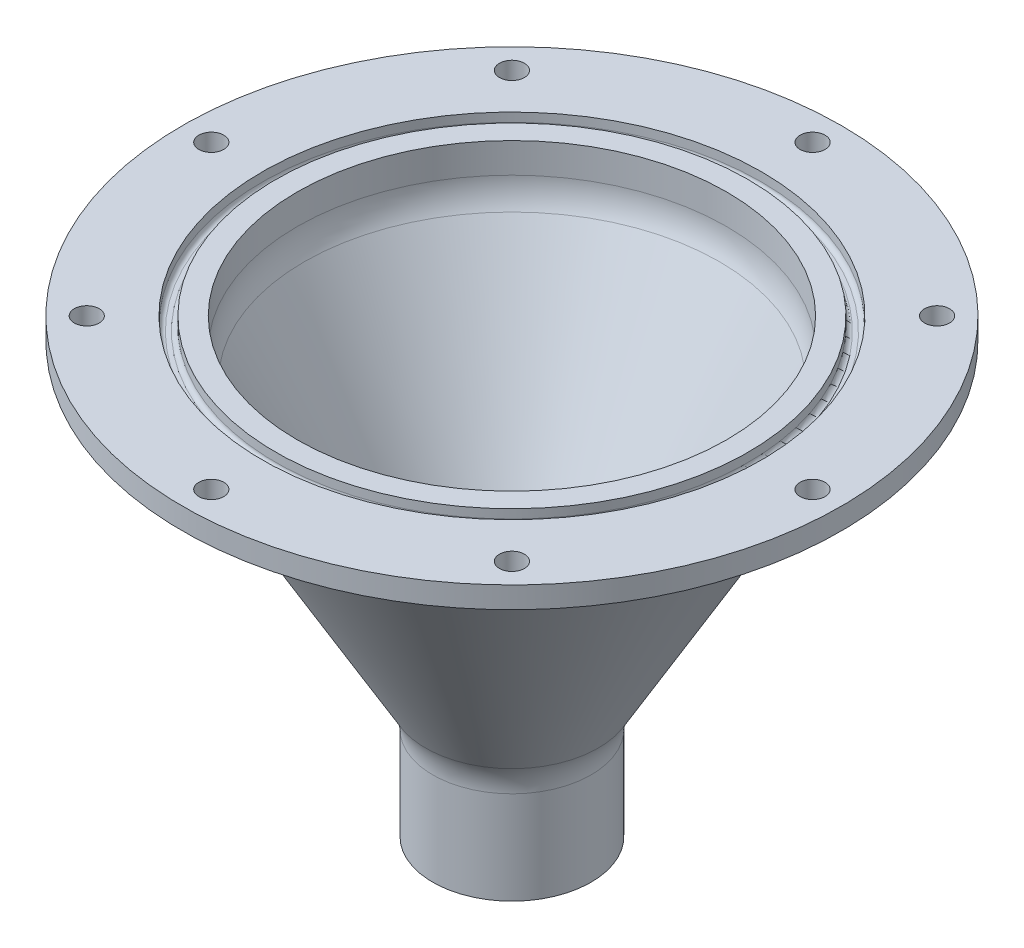
ISO-10303-21;
HEADER;
FILE_DESCRIPTION(('STEP AP214'),'2;1');
FILE_NAME('part.step','',(''),(''),'','','');
FILE_SCHEMA(('AUTOMOTIVE_DESIGN { 1 0 10303 214 1 1 1 1 }'));
ENDSEC;
DATA;
#1=APPLICATION_CONTEXT('core data for automotive mechanical design processes');
#2=APPLICATION_PROTOCOL_DEFINITION('international standard','automotive_design',2000,#1);
#3=PRODUCT_CONTEXT('',#1,'mechanical');
#4=PRODUCT('Part','Part','',(#3));
#5=PRODUCT_RELATED_PRODUCT_CATEGORY('part','',(#4));
#6=PRODUCT_DEFINITION_FORMATION('','',#4);
#7=PRODUCT_DEFINITION_CONTEXT('part definition',#1,'design');
#8=PRODUCT_DEFINITION('design','',#6,#7);
#9=PRODUCT_DEFINITION_SHAPE('','',#8);
#10=(LENGTH_UNIT() NAMED_UNIT(*) SI_UNIT(.MILLI.,.METRE.));
#11=(NAMED_UNIT(*) PLANE_ANGLE_UNIT() SI_UNIT($,.RADIAN.));
#12=(NAMED_UNIT(*) SI_UNIT($,.STERADIAN.) SOLID_ANGLE_UNIT());
#13=UNCERTAINTY_MEASURE_WITH_UNIT(LENGTH_MEASURE(1.E-05),#10,'distance_accuracy_value','');
#14=(GEOMETRIC_REPRESENTATION_CONTEXT(3) GLOBAL_UNCERTAINTY_ASSIGNED_CONTEXT((#13)) GLOBAL_UNIT_ASSIGNED_CONTEXT((#10,
#11,#12)) REPRESENTATION_CONTEXT('',''));
#15=CARTESIAN_POINT('',(0.,0.,0.));
#16=DIRECTION('',(0.,0.,1.));
#17=DIRECTION('',(1.,0.,0.));
#18=AXIS2_PLACEMENT_3D('',#15,#16,#17);
#19=CARTESIAN_POINT('',(9.36625,0.,0.));
#20=DIRECTION('',(0.,-1.,0.));
#21=DIRECTION('',(0.,0.,-1.));
#22=AXIS2_PLACEMENT_3D('',#19,#20,#21);
#23=PLANE('',#22);
#24=CARTESIAN_POINT('',(0.,0.,0.));
#25=DIRECTION('',(0.,-1.,0.));
#26=DIRECTION('',(0.,0.,-1.));
#27=AXIS2_PLACEMENT_3D('',#24,#25,#26);
#28=CIRCLE('',#27,9.36625);
#29=CARTESIAN_POINT('',(0.,0.,-9.36625));
#30=VERTEX_POINT('',#29);
#31=EDGE_CURVE('E105',#30,#30,#28,.T.);
#32=ORIENTED_EDGE('',*,*,#31,.T.);
#33=EDGE_LOOP('',(#32));
#34=FACE_BOUND('',#33,.T.);
#35=CARTESIAN_POINT('',(0.,0.,0.));
#36=DIRECTION('',(0.,-1.,0.));
#37=DIRECTION('',(0.,0.,-1.));
#38=AXIS2_PLACEMENT_3D('',#35,#36,#37);
#39=CIRCLE('',#38,5.55625);
#40=CARTESIAN_POINT('',(0.,0.,-5.55625));
#41=VERTEX_POINT('',#40);
#42=EDGE_CURVE('E10',#41,#41,#39,.T.);
#43=ORIENTED_EDGE('',*,*,#42,.F.);
#44=EDGE_LOOP('',(#43));
#45=FACE_BOUND('',#44,.T.);
#46=ADVANCED_FACE('F35',(#34,#45),#23,.T.);
#47=CARTESIAN_POINT('',(0.,0.,0.));
#48=DIRECTION('',(0.,-1.,0.));
#49=DIRECTION('',(0.,0.,-1.));
#50=AXIS2_PLACEMENT_3D('',#47,#48,#49);
#51=CYLINDRICAL_SURFACE('',#50,5.55625);
#52=ORIENTED_EDGE('',*,*,#42,.T.);
#53=EDGE_LOOP('',(#52));
#54=FACE_BOUND('',#53,.T.);
#55=CARTESIAN_POINT('',(0.,12.0194090512249,0.));
#56=DIRECTION('',(0.,-1.,0.));
#57=DIRECTION('',(0.,0.,-1.));
#58=AXIS2_PLACEMENT_3D('',#55,#56,#57);
#59=CIRCLE('',#58,5.55625);
#60=CARTESIAN_POINT('',(0.,12.0194090512249,-5.55625));
#61=VERTEX_POINT('',#60);
#62=EDGE_CURVE('E42',#61,#61,#59,.T.);
#63=ORIENTED_EDGE('',*,*,#62,.F.);
#64=EDGE_LOOP('',(#63));
#65=FACE_BOUND('',#64,.T.);
#66=ADVANCED_FACE('F206',(#54,#65),#51,.F.);
#67=CARTESIAN_POINT('',(0.,12.0194090512249,0.));
#68=DIRECTION('',(0.,-1.,0.));
#69=DIRECTION('',(0.,0.,-1.));
#70=AXIS2_PLACEMENT_3D('',#67,#68,#69);
#71=TOROIDAL_SURFACE('',#70,11.90625,6.35);
#72=ORIENTED_EDGE('',*,*,#62,.T.);
#73=EDGE_LOOP('',(#72));
#74=FACE_BOUND('',#73,.T.);
#75=CARTESIAN_POINT('',(0.,15.1944090512249,0.));
#76=DIRECTION('',(0.,-1.,0.));
#77=DIRECTION('',(0.,0.,-1.));
#78=AXIS2_PLACEMENT_3D('',#75,#76,#77);
#79=CIRCLE('',#78,6.40698868596882);
#80=CARTESIAN_POINT('',(0.,15.1944090512249,6.40698868596882));
#81=VERTEX_POINT('',#80);
#82=EDGE_CURVE('E46',#81,#81,#79,.T.);
#83=ORIENTED_EDGE('',*,*,#82,.F.);
#84=EDGE_LOOP('',(#83));
#85=FACE_BOUND('',#84,.T.);
#86=ADVANCED_FACE('F210',(#74,#85),#71,.T.);
#87=CARTESIAN_POINT('',(0.,46.617747007795,0.));
#88=DIRECTION('',(0.,1.,0.));
#89=DIRECTION('',(0.,0.,1.));
#90=AXIS2_PLACEMENT_3D('',#87,#88,#89);
#91=CONICAL_SURFACE('',#90,24.5492613140312,0.5235987755983);
#92=CARTESIAN_POINT('',(0.,46.617747007795,0.));
#93=DIRECTION('',(0.,-1.,0.));
#94=DIRECTION('',(0.,0.,-1.));
#95=AXIS2_PLACEMENT_3D('',#92,#93,#94);
#96=CIRCLE('',#95,24.5492613140312);
#97=CARTESIAN_POINT('',(0.,46.617747007795,24.5492613140312));
#98=VERTEX_POINT('',#97);
#99=EDGE_CURVE('E51',#98,#98,#96,.T.);
#100=CARTESIAN_POINT('',(0.,15.1944090512249,6.40698868596882));
#101=CARTESIAN_POINT('',(0.,15.5217354882725,6.59597069251114));
#102=CARTESIAN_POINT('',(0.,15.8490619253201,6.78495269905345));
#103=CARTESIAN_POINT('',(0.,16.5037147994154,7.16291671213809));
#104=CARTESIAN_POINT('',(0.,16.831041236463,7.3518987186804));
#105=CARTESIAN_POINT('',(0.,17.4856941105582,7.72986273176503));
#106=CARTESIAN_POINT('',(0.,17.8130205476058,7.91884473830735));
#107=CARTESIAN_POINT('',(0.,18.467673421701,8.29680875139198));
#108=CARTESIAN_POINT('',(0.,18.7949998587486,8.4857907579343));
#109=CARTESIAN_POINT('',(0.,19.4496527328438,8.86375477101893));
#110=CARTESIAN_POINT('',(0.,19.7769791698914,9.05273677756125));
#111=CARTESIAN_POINT('',(0.,20.4316320439866,9.43070079064588));
#112=CARTESIAN_POINT('',(0.,20.7589584810342,9.6196827971882));
#113=CARTESIAN_POINT('',(0.,21.4136113551294,9.99764681027283));
#114=CARTESIAN_POINT('',(0.,21.740937792177,10.1866288168151));
#115=CARTESIAN_POINT('',(0.,22.3955906662722,10.5645928298998));
#116=CARTESIAN_POINT('',(0.,22.7229171033199,10.7535748364421));
#117=CARTESIAN_POINT('',(0.,23.3775699774151,11.1315388495267));
#118=CARTESIAN_POINT('',(0.,23.7048964144627,11.320520856069));
#119=CARTESIAN_POINT('',(0.,24.3595492885579,11.6984848691537));
#120=CARTESIAN_POINT('',(0.,24.6868757256055,11.887466875696));
#121=CARTESIAN_POINT('',(0.,25.3415285997007,12.2654308887806));
#122=CARTESIAN_POINT('',(0.,25.6688550367483,12.4544128953229));
#123=CARTESIAN_POINT('',(0.,26.3235079108435,12.8323769084076));
#124=CARTESIAN_POINT('',(0.,26.6508343478911,13.0213589149499));
#125=CARTESIAN_POINT('',(0.,27.3054872219863,13.3993229280345));
#126=CARTESIAN_POINT('',(0.,27.6328136590339,13.5883049345768));
#127=CARTESIAN_POINT('',(0.,28.2874665331291,13.9662689476615));
#128=CARTESIAN_POINT('',(0.,28.6147929701767,14.1552509542038));
#129=CARTESIAN_POINT('',(0.,29.269445844272,14.5332149672884));
#130=CARTESIAN_POINT('',(0.,29.5967722813196,14.7221969738307));
#131=CARTESIAN_POINT('',(0.,30.2514251554148,15.1001609869154));
#132=CARTESIAN_POINT('',(0.,30.5787515924624,15.2891429934577));
#133=CARTESIAN_POINT('',(0.,31.2334044665576,15.6671070065423));
#134=CARTESIAN_POINT('',(0.,31.5607309036052,15.8560890130846));
#135=CARTESIAN_POINT('',(0.,32.2153837777004,16.2340530261693));
#136=CARTESIAN_POINT('',(0.,32.542710214748,16.4230350327116));
#137=CARTESIAN_POINT('',(0.,33.1973630888432,16.8009990457962));
#138=CARTESIAN_POINT('',(0.,33.5246895258908,16.9899810523385));
#139=CARTESIAN_POINT('',(0.,34.179342399986,17.3679450654232));
#140=CARTESIAN_POINT('',(0.,34.5066688370336,17.5569270719655));
#141=CARTESIAN_POINT('',(0.,35.1613217111288,17.9348910850501));
#142=CARTESIAN_POINT('',(0.,35.4886481481764,18.1238730915924));
#143=CARTESIAN_POINT('',(0.,36.1433010222717,18.5018371046771));
#144=CARTESIAN_POINT('',(0.,36.4706274593193,18.6908191112194));
#145=CARTESIAN_POINT('',(0.,37.1252803334145,19.068783124304));
#146=CARTESIAN_POINT('',(0.,37.4526067704621,19.2577651308463));
#147=CARTESIAN_POINT('',(0.,38.1072596445573,19.635729143931));
#148=CARTESIAN_POINT('',(0.,38.4345860816049,19.8247111504733));
#149=CARTESIAN_POINT('',(0.,39.0892389557001,20.2026751635579));
#150=CARTESIAN_POINT('',(0.,39.4165653927477,20.3916571701002));
#151=CARTESIAN_POINT('',(0.,40.0712182668429,20.7696211831849));
#152=CARTESIAN_POINT('',(0.,40.3985447038905,20.9586031897272));
#153=CARTESIAN_POINT('',(0.,41.0531975779857,21.3365672028118));
#154=CARTESIAN_POINT('',(0.,41.3805240150333,21.5255492093541));
#155=CARTESIAN_POINT('',(0.,42.0351768891285,21.9035132224388));
#156=CARTESIAN_POINT('',(0.,42.3625033261761,22.0924952289811));
#157=CARTESIAN_POINT('',(0.,43.0171562002714,22.4704592420657));
#158=CARTESIAN_POINT('',(0.,43.344482637319,22.659441248608));
#159=CARTESIAN_POINT('',(0.,43.9991355114142,23.0374052616926));
#160=CARTESIAN_POINT('',(0.,44.3264619484618,23.226387268235));
#161=CARTESIAN_POINT('',(0.,44.981114822557,23.6043512813196));
#162=CARTESIAN_POINT('',(0.,45.3084412596046,23.7933332878619));
#163=CARTESIAN_POINT('',(0.,45.9630941336998,24.1712973009465));
#164=CARTESIAN_POINT('',(0.,46.2904205707474,24.3602793074889));
#165=CARTESIAN_POINT('',(0.,46.617747007795,24.5492613140312));
#166=B_SPLINE_CURVE_WITH_KNOTS('',3,(#100,#101,#102,#103,#104,#105,#106,#107,#108,#109,#110,
#111,#112,#113,#114,#115,#116,#117,#118,#119,#120,#121,#122,#123,#124,#125,#126,#127,#128,#129,
#130,#131,#132,#133,#134,#135,#136,#137,#138,#139,#140,#141,#142,#143,#144,#145,#146,#147,#148,
#149,#150,#151,#152,#153,#154,#155,#156,#157,#158,#159,#160,#161,#162,#163,#164,#165),
.UNSPECIFIED.,.F.,.F.,(4,2,2,2,2,2,2,2,2,2,2,2,2,2,2,2,2,2,2,2,2,2,2,2,2,2,2,2,2,2,2,2,4),(0.,
1.1338920392539,2.26778407850779,3.40167611776169,4.53556815701558,5.66946019626948,
6.80335223552338,7.93724427477727,9.07113631403116,10.2050283532851,11.338920392539,
12.4728124317929,13.6067044710467,14.7405965103006,15.8744885495545,17.0083805888084,
18.1422726280623,19.2761646673162,20.4100567065701,21.543948745824,22.6778407850779,
23.8117328243318,24.9456248635857,26.0795169028396,27.2134089420935,28.3473009813474,
29.4811930206013,30.6150850598552,31.7489770991091,32.882869138363,34.0167611776169,
35.1506532168708,36.2845452561247),.UNSPECIFIED.);
#167=EDGE_CURVE('BSEAM214',#81,#98,#166,.T.);
#168=ORIENTED_EDGE('',*,*,#82,.T.);
#169=ORIENTED_EDGE('',*,*,#99,.F.);
#170=ORIENTED_EDGE('',*,*,#167,.T.);
#171=ORIENTED_EDGE('',*,*,#167,.F.);
#172=EDGE_LOOP('',(#168,#170,#169,#171));
#173=FACE_BOUND('',#172,.T.);
#174=ADVANCED_FACE('F214',(#173),#91,.F.);
#175=CARTESIAN_POINT('',(0.,49.7927470077951,0.));
#176=DIRECTION('',(0.,-1.,0.));
#177=DIRECTION('',(0.,0.,-1.));
#178=AXIS2_PLACEMENT_3D('',#175,#176,#177);
#179=TOROIDAL_SURFACE('',#178,19.05,6.35000000000001);
#180=ORIENTED_EDGE('',*,*,#99,.T.);
#181=EDGE_LOOP('',(#180));
#182=FACE_BOUND('',#181,.T.);
#183=CARTESIAN_POINT('',(0.,49.792747007795,0.));
#184=DIRECTION('',(0.,-1.,0.));
#185=DIRECTION('',(0.,0.,-1.));
#186=AXIS2_PLACEMENT_3D('',#183,#184,#185);
#187=CIRCLE('',#186,25.4);
#188=CARTESIAN_POINT('',(0.,49.792747007795,-25.4));
#189=VERTEX_POINT('',#188);
#190=EDGE_CURVE('E55',#189,#189,#187,.T.);
#191=ORIENTED_EDGE('',*,*,#190,.F.);
#192=EDGE_LOOP('',(#191));
#193=FACE_BOUND('',#192,.T.);
#194=ADVANCED_FACE('F221',(#182,#193),#179,.F.);
#195=CARTESIAN_POINT('',(0.,0.,0.));
#196=DIRECTION('',(0.,-1.,0.));
#197=DIRECTION('',(0.,0.,-1.));
#198=AXIS2_PLACEMENT_3D('',#195,#196,#197);
#199=CYLINDRICAL_SURFACE('',#198,25.4);
#200=ORIENTED_EDGE('',*,*,#190,.T.);
#201=EDGE_LOOP('',(#200));
#202=FACE_BOUND('',#201,.T.);
#203=CARTESIAN_POINT('',(0.,53.34,0.));
#204=DIRECTION('',(0.,-1.,0.));
#205=DIRECTION('',(0.,0.,-1.));
#206=AXIS2_PLACEMENT_3D('',#203,#204,#205);
#207=CIRCLE('',#206,25.4);
#208=CARTESIAN_POINT('',(0.,53.34,-25.4));
#209=VERTEX_POINT('',#208);
#210=EDGE_CURVE('E59',#209,#209,#207,.T.);
#211=ORIENTED_EDGE('',*,*,#210,.F.);
#212=EDGE_LOOP('',(#211));
#213=FACE_BOUND('',#212,.T.);
#214=ADVANCED_FACE('F225',(#202,#213),#199,.F.);
#215=CARTESIAN_POINT('',(25.4,53.34,0.));
#216=DIRECTION('',(0.,1.,0.));
#217=DIRECTION('',(0.,0.,1.));
#218=AXIS2_PLACEMENT_3D('',#215,#216,#217);
#219=PLANE('',#218);
#220=ORIENTED_EDGE('',*,*,#210,.T.);
#221=EDGE_LOOP('',(#220));
#222=FACE_BOUND('',#221,.T.);
#223=CARTESIAN_POINT('',(0.,53.34,0.));
#224=DIRECTION('',(0.,-1.,0.));
#225=DIRECTION('',(0.,0.,-1.));
#226=AXIS2_PLACEMENT_3D('',#223,#224,#225);
#227=CIRCLE('',#226,27.94);
#228=CARTESIAN_POINT('',(0.,53.34,-27.94));
#229=VERTEX_POINT('',#228);
#230=EDGE_CURVE('E63',#229,#229,#227,.T.);
#231=ORIENTED_EDGE('',*,*,#230,.F.);
#232=EDGE_LOOP('',(#231));
#233=FACE_BOUND('',#232,.T.);
#234=ADVANCED_FACE('F229',(#222,#233),#219,.T.);
#235=CARTESIAN_POINT('',(0.,0.,0.));
#236=DIRECTION('',(0.,-1.,0.));
#237=DIRECTION('',(0.,0.,-1.));
#238=AXIS2_PLACEMENT_3D('',#235,#236,#237);
#239=CYLINDRICAL_SURFACE('',#238,27.94);
#240=ORIENTED_EDGE('',*,*,#230,.T.);
#241=EDGE_LOOP('',(#240));
#242=FACE_BOUND('',#241,.T.);
#243=CARTESIAN_POINT('',(0.,52.29225,0.));
#244=DIRECTION('',(0.,-1.,0.));
#245=DIRECTION('',(0.,0.,-1.));
#246=AXIS2_PLACEMENT_3D('',#243,#244,#245);
#247=CIRCLE('',#246,27.94);
#248=CARTESIAN_POINT('',(0.,52.29225,-27.94));
#249=VERTEX_POINT('',#248);
#250=EDGE_CURVE('E66',#249,#249,#247,.T.);
#251=ORIENTED_EDGE('',*,*,#250,.F.);
#252=EDGE_LOOP('',(#251));
#253=FACE_BOUND('',#252,.T.);
#254=ADVANCED_FACE('F233',(#242,#253),#239,.T.);
#255=CARTESIAN_POINT('',(0.,52.29225,0.));
#256=DIRECTION('',(0.,-1.,0.));
#257=DIRECTION('',(0.,0.,-1.));
#258=AXIS2_PLACEMENT_3D('',#255,#256,#257);
#259=TOROIDAL_SURFACE('',#258,28.47975,0.539749999999999);
#260=ORIENTED_EDGE('',*,*,#250,.T.);
#261=EDGE_LOOP('',(#260));
#262=FACE_BOUND('',#261,.T.);
#263=CARTESIAN_POINT('',(0.,51.7525,0.));
#264=DIRECTION('',(0.,-1.,0.));
#265=DIRECTION('',(0.,0.,-1.));
#266=AXIS2_PLACEMENT_3D('',#263,#264,#265);
#267=CIRCLE('',#266,28.47975);
#268=CARTESIAN_POINT('',(0.,51.7525,-28.47975));
#269=VERTEX_POINT('',#268);
#270=EDGE_CURVE('E69',#269,#269,#267,.T.);
#271=ORIENTED_EDGE('',*,*,#270,.F.);
#272=EDGE_LOOP('',(#271));
#273=FACE_BOUND('',#272,.T.);
#274=ADVANCED_FACE('F237',(#262,#273),#259,.F.);
#275=CARTESIAN_POINT('',(28.47975,51.7525,0.));
#276=DIRECTION('',(0.,1.,0.));
#277=DIRECTION('',(0.,0.,1.));
#278=AXIS2_PLACEMENT_3D('',#275,#276,#277);
#279=PLANE('',#278);
#280=ORIENTED_EDGE('',*,*,#270,.T.);
#281=EDGE_LOOP('',(#280));
#282=FACE_BOUND('',#281,.T.);
#283=CARTESIAN_POINT('',(0.,51.7525,0.));
#284=DIRECTION('',(0.,-1.,0.));
#285=DIRECTION('',(0.,0.,-1.));
#286=AXIS2_PLACEMENT_3D('',#283,#284,#285);
#287=CIRCLE('',#286,28.98775);
#288=CARTESIAN_POINT('',(0.,51.7525,-28.98775));
#289=VERTEX_POINT('',#288);
#290=EDGE_CURVE('E72',#289,#289,#287,.T.);
#291=ORIENTED_EDGE('',*,*,#290,.F.);
#292=EDGE_LOOP('',(#291));
#293=FACE_BOUND('',#292,.T.);
#294=ADVANCED_FACE('F241',(#282,#293),#279,.T.);
#295=CARTESIAN_POINT('',(0.,52.29225,0.));
#296=DIRECTION('',(0.,-1.,0.));
#297=DIRECTION('',(0.,0.,-1.));
#298=AXIS2_PLACEMENT_3D('',#295,#296,#297);
#299=TOROIDAL_SURFACE('',#298,28.98775,0.539749999999999);
#300=ORIENTED_EDGE('',*,*,#290,.T.);
#301=EDGE_LOOP('',(#300));
#302=FACE_BOUND('',#301,.T.);
#303=CARTESIAN_POINT('',(0.,52.29225,0.));
#304=DIRECTION('',(0.,-1.,0.));
#305=DIRECTION('',(0.,0.,-1.));
#306=AXIS2_PLACEMENT_3D('',#303,#304,#305);
#307=CIRCLE('',#306,29.5275);
#308=CARTESIAN_POINT('',(0.,52.29225,-29.5275));
#309=VERTEX_POINT('',#308);
#310=EDGE_CURVE('E75',#309,#309,#307,.T.);
#311=ORIENTED_EDGE('',*,*,#310,.F.);
#312=EDGE_LOOP('',(#311));
#313=FACE_BOUND('',#312,.T.);
#314=ADVANCED_FACE('F245',(#302,#313),#299,.F.);
#315=CARTESIAN_POINT('',(0.,0.,0.));
#316=DIRECTION('',(0.,-1.,0.));
#317=DIRECTION('',(0.,0.,-1.));
#318=AXIS2_PLACEMENT_3D('',#315,#316,#317);
#319=CYLINDRICAL_SURFACE('',#318,29.5275);
#320=ORIENTED_EDGE('',*,*,#310,.T.);
#321=EDGE_LOOP('',(#320));
#322=FACE_BOUND('',#321,.T.);
#323=CARTESIAN_POINT('',(0.,53.34,0.));
#324=DIRECTION('',(0.,-1.,0.));
#325=DIRECTION('',(0.,0.,-1.));
#326=AXIS2_PLACEMENT_3D('',#323,#324,#325);
#327=CIRCLE('',#326,29.5275);
#328=CARTESIAN_POINT('',(0.,53.34,-29.5275));
#329=VERTEX_POINT('',#328);
#330=EDGE_CURVE('E79',#329,#329,#327,.T.);
#331=ORIENTED_EDGE('',*,*,#330,.F.);
#332=EDGE_LOOP('',(#331));
#333=FACE_BOUND('',#332,.T.);
#334=ADVANCED_FACE('F249',(#322,#333),#319,.F.);
#335=CARTESIAN_POINT('',(29.5275,53.34,0.));
#336=DIRECTION('',(0.,1.,0.));
#337=DIRECTION('',(0.,0.,1.));
#338=AXIS2_PLACEMENT_3D('',#335,#336,#337);
#339=PLANE('',#338);
#340=CARTESIAN_POINT('',(-35.56,53.34,0.));
#341=DIRECTION('',(0.,1.,0.));
#342=DIRECTION('',(0.,0.,1.));
#343=AXIS2_PLACEMENT_3D('',#340,#341,#342);
#344=CIRCLE('',#343,1.47319999999999);
#345=CARTESIAN_POINT('',(-35.56,53.34,1.47319999999999));
#346=VERTEX_POINT('',#345);
#347=EDGE_CURVE('E147',#346,#346,#344,.T.);
#348=ORIENTED_EDGE('',*,*,#347,.F.);
#349=EDGE_LOOP('',(#348));
#350=FACE_BOUND('',#349,.T.);
#351=CARTESIAN_POINT('',(-25.1447171389936,53.34,25.1447171389937));
#352=DIRECTION('',(0.,1.,0.));
#353=DIRECTION('',(0.,0.,1.));
#354=AXIS2_PLACEMENT_3D('',#351,#352,#353);
#355=CIRCLE('',#354,1.47319999999999);
#356=CARTESIAN_POINT('',(-25.1447171389936,53.34,26.6179171389937));
#357=VERTEX_POINT('',#356);
#358=EDGE_CURVE('E38',#357,#357,#355,.T.);
#359=ORIENTED_EDGE('',*,*,#358,.F.);
#360=EDGE_LOOP('',(#359));
#361=FACE_BOUND('',#360,.T.);
#362=CARTESIAN_POINT('',(1.24157076409262E-13,53.34,35.56));
#363=DIRECTION('',(0.,1.,0.));
#364=DIRECTION('',(0.,0.,1.));
#365=AXIS2_PLACEMENT_3D('',#362,#363,#364);
#366=CIRCLE('',#365,1.47319999999999);
#367=CARTESIAN_POINT('',(1.24157076409262E-13,53.34,37.0332));
#368=VERTEX_POINT('',#367);
#369=EDGE_CURVE('E138',#368,#368,#366,.T.);
#370=ORIENTED_EDGE('',*,*,#369,.F.);
#371=EDGE_LOOP('',(#370));
#372=FACE_BOUND('',#371,.T.);
#373=CARTESIAN_POINT('',(25.1447171389938,53.34,25.1447171389935));
#374=DIRECTION('',(0.,1.,0.));
#375=DIRECTION('',(0.,0.,1.));
#376=AXIS2_PLACEMENT_3D('',#373,#374,#375);
#377=CIRCLE('',#376,1.47319999999999);
#378=CARTESIAN_POINT('',(25.1447171389938,53.34,26.6179171389935));
#379=VERTEX_POINT('',#378);
#380=EDGE_CURVE('E132',#379,#379,#377,.T.);
#381=ORIENTED_EDGE('',*,*,#380,.F.);
#382=EDGE_LOOP('',(#381));
#383=FACE_BOUND('',#382,.T.);
#384=CARTESIAN_POINT('',(35.56,53.34,-2.48314152818524E-13));
#385=DIRECTION('',(0.,1.,0.));
#386=DIRECTION('',(0.,0.,1.));
#387=AXIS2_PLACEMENT_3D('',#384,#385,#386);
#388=CIRCLE('',#387,1.47319999999999);
#389=CARTESIAN_POINT('',(35.56,53.34,1.47319999999975));
#390=VERTEX_POINT('',#389);
#391=EDGE_CURVE('E126',#390,#390,#388,.T.);
#392=ORIENTED_EDGE('',*,*,#391,.F.);
#393=EDGE_LOOP('',(#392));
#394=FACE_BOUND('',#393,.T.);
#395=CARTESIAN_POINT('',(25.1447171389934,53.34,-25.1447171389938));
#396=DIRECTION('',(0.,1.,0.));
#397=DIRECTION('',(0.,0.,1.));
#398=AXIS2_PLACEMENT_3D('',#395,#396,#397);
#399=CIRCLE('',#398,1.47319999999999);
#400=CARTESIAN_POINT('',(25.1447171389934,53.34,-23.6715171389938));
#401=VERTEX_POINT('',#400);
#402=EDGE_CURVE('E120',#401,#401,#399,.T.);
#403=ORIENTED_EDGE('',*,*,#402,.F.);
#404=EDGE_LOOP('',(#403));
#405=FACE_BOUND('',#404,.T.);
#406=CARTESIAN_POINT('',(-3.72471229227785E-13,53.34,-35.56));
#407=DIRECTION('',(0.,1.,0.));
#408=DIRECTION('',(0.,0.,1.));
#409=AXIS2_PLACEMENT_3D('',#406,#407,#408);
#410=CIRCLE('',#409,1.47319999999999);
#411=CARTESIAN_POINT('',(-3.72471229227785E-13,53.34,-34.0868));
#412=VERTEX_POINT('',#411);
#413=EDGE_CURVE('E114',#412,#412,#410,.T.);
#414=ORIENTED_EDGE('',*,*,#413,.F.);
#415=EDGE_LOOP('',(#414));
#416=FACE_BOUND('',#415,.T.);
#417=CARTESIAN_POINT('',(-25.1447171389939,53.34,-25.1447171389933));
#418=DIRECTION('',(0.,1.,0.));
#419=DIRECTION('',(0.,0.,1.));
#420=AXIS2_PLACEMENT_3D('',#417,#418,#419);
#421=CIRCLE('',#420,1.47319999999999);
#422=CARTESIAN_POINT('',(-25.1447171389939,53.34,-23.6715171389933));
#423=VERTEX_POINT('',#422);
#424=EDGE_CURVE('E108',#423,#423,#421,.T.);
#425=ORIENTED_EDGE('',*,*,#424,.F.);
#426=EDGE_LOOP('',(#425));
#427=FACE_BOUND('',#426,.T.);
#428=ORIENTED_EDGE('',*,*,#330,.T.);
#429=EDGE_LOOP('',(#428));
#430=FACE_BOUND('',#429,.T.);
#431=CARTESIAN_POINT('',(0.,53.34,0.));
#432=DIRECTION('',(0.,-1.,0.));
#433=DIRECTION('',(0.,0.,-1.));
#434=AXIS2_PLACEMENT_3D('',#431,#432,#433);
#435=CIRCLE('',#434,38.9832952561248);
#436=CARTESIAN_POINT('',(0.,53.34,-38.9832952561248));
#437=VERTEX_POINT('',#436);
#438=EDGE_CURVE('E83',#437,#437,#435,.T.);
#439=ORIENTED_EDGE('',*,*,#438,.F.);
#440=EDGE_LOOP('',(#439));
#441=FACE_BOUND('',#440,.T.);
#442=ADVANCED_FACE('F253',(#350,#361,#372,#383,#394,#405,#416,#427,#430,#441),#339,.T.);
#443=CARTESIAN_POINT('',(0.,0.,0.));
#444=DIRECTION('',(0.,-1.,0.));
#445=DIRECTION('',(0.,0.,-1.));
#446=AXIS2_PLACEMENT_3D('',#443,#444,#445);
#447=CYLINDRICAL_SURFACE('',#446,38.9832952561248);
#448=ORIENTED_EDGE('',*,*,#438,.T.);
#449=EDGE_LOOP('',(#448));
#450=FACE_BOUND('',#449,.T.);
#451=CARTESIAN_POINT('',(0.,50.8,0.));
#452=DIRECTION('',(0.,-1.,0.));
#453=DIRECTION('',(0.,0.,-1.));
#454=AXIS2_PLACEMENT_3D('',#451,#452,#453);
#455=CIRCLE('',#454,38.9832952561248);
#456=CARTESIAN_POINT('',(0.,50.8,-38.9832952561248));
#457=VERTEX_POINT('',#456);
#458=EDGE_CURVE('E87',#457,#457,#455,.T.);
#459=ORIENTED_EDGE('',*,*,#458,.F.);
#460=EDGE_LOOP('',(#459));
#461=FACE_BOUND('',#460,.T.);
#462=ADVANCED_FACE('F160',(#450,#461),#447,.T.);
#463=CARTESIAN_POINT('',(38.9832952561248,50.8,0.));
#464=DIRECTION('',(0.,-1.,0.));
#465=DIRECTION('',(0.,0.,-1.));
#466=AXIS2_PLACEMENT_3D('',#463,#464,#465);
#467=PLANE('',#466);
#468=CARTESIAN_POINT('',(-35.56,50.8,0.));
#469=DIRECTION('',(0.,-1.,0.));
#470=DIRECTION('',(0.,0.,-1.));
#471=AXIS2_PLACEMENT_3D('',#468,#469,#470);
#472=CIRCLE('',#471,1.47319999999999);
#473=CARTESIAN_POINT('',(-35.56,50.8,-1.47319999999999));
#474=VERTEX_POINT('',#473);
#475=EDGE_CURVE('E150',#474,#474,#472,.T.);
#476=ORIENTED_EDGE('',*,*,#475,.F.);
#477=EDGE_LOOP('',(#476));
#478=FACE_BOUND('',#477,.T.);
#479=CARTESIAN_POINT('',(-25.1447171389936,50.8,25.1447171389937));
#480=DIRECTION('',(0.,-1.,0.));
#481=DIRECTION('',(0.,0.,-1.));
#482=AXIS2_PLACEMENT_3D('',#479,#480,#481);
#483=CIRCLE('',#482,1.47319999999999);
#484=CARTESIAN_POINT('',(-25.1447171389936,50.8,23.6715171389937));
#485=VERTEX_POINT('',#484);
#486=EDGE_CURVE('E144',#485,#485,#483,.T.);
#487=ORIENTED_EDGE('',*,*,#486,.F.);
#488=EDGE_LOOP('',(#487));
#489=FACE_BOUND('',#488,.T.);
#490=CARTESIAN_POINT('',(1.24157076409262E-13,50.8,35.56));
#491=DIRECTION('',(0.,-1.,0.));
#492=DIRECTION('',(0.,0.,-1.));
#493=AXIS2_PLACEMENT_3D('',#490,#491,#492);
#494=CIRCLE('',#493,1.4732);
#495=CARTESIAN_POINT('',(1.24157076409262E-13,50.8,34.0868));
#496=VERTEX_POINT('',#495);
#497=EDGE_CURVE('E141',#496,#496,#494,.T.);
#498=ORIENTED_EDGE('',*,*,#497,.F.);
#499=EDGE_LOOP('',(#498));
#500=FACE_BOUND('',#499,.T.);
#501=CARTESIAN_POINT('',(25.1447171389938,50.8,25.1447171389935));
#502=DIRECTION('',(0.,-1.,0.));
#503=DIRECTION('',(0.,0.,-1.));
#504=AXIS2_PLACEMENT_3D('',#501,#502,#503);
#505=CIRCLE('',#504,1.47319999999999);
#506=CARTESIAN_POINT('',(25.1447171389938,50.8,23.6715171389935));
#507=VERTEX_POINT('',#506);
#508=EDGE_CURVE('E135',#507,#507,#505,.T.);
#509=ORIENTED_EDGE('',*,*,#508,.F.);
#510=EDGE_LOOP('',(#509));
#511=FACE_BOUND('',#510,.T.);
#512=CARTESIAN_POINT('',(35.56,50.8,-2.48314152818524E-13));
#513=DIRECTION('',(0.,-1.,0.));
#514=DIRECTION('',(0.,0.,-1.));
#515=AXIS2_PLACEMENT_3D('',#512,#513,#514);
#516=CIRCLE('',#515,1.47319999999999);
#517=CARTESIAN_POINT('',(35.56,50.8,-1.47320000000024));
#518=VERTEX_POINT('',#517);
#519=EDGE_CURVE('E129',#518,#518,#516,.T.);
#520=ORIENTED_EDGE('',*,*,#519,.F.);
#521=EDGE_LOOP('',(#520));
#522=FACE_BOUND('',#521,.T.);
#523=CARTESIAN_POINT('',(25.1447171389934,50.8,-25.1447171389938));
#524=DIRECTION('',(0.,-1.,0.));
#525=DIRECTION('',(0.,0.,-1.));
#526=AXIS2_PLACEMENT_3D('',#523,#524,#525);
#527=CIRCLE('',#526,1.47319999999999);
#528=CARTESIAN_POINT('',(25.1447171389934,50.8,-26.6179171389938));
#529=VERTEX_POINT('',#528);
#530=EDGE_CURVE('E123',#529,#529,#527,.T.);
#531=ORIENTED_EDGE('',*,*,#530,.F.);
#532=EDGE_LOOP('',(#531));
#533=FACE_BOUND('',#532,.T.);
#534=CARTESIAN_POINT('',(-3.72471229227785E-13,50.8,-35.56));
#535=DIRECTION('',(0.,-1.,0.));
#536=DIRECTION('',(0.,0.,-1.));
#537=AXIS2_PLACEMENT_3D('',#534,#535,#536);
#538=CIRCLE('',#537,1.4732);
#539=CARTESIAN_POINT('',(-3.72471229227785E-13,50.8,-37.0332));
#540=VERTEX_POINT('',#539);
#541=EDGE_CURVE('E117',#540,#540,#538,.T.);
#542=ORIENTED_EDGE('',*,*,#541,.F.);
#543=EDGE_LOOP('',(#542));
#544=FACE_BOUND('',#543,.T.);
#545=CARTESIAN_POINT('',(-25.1447171389939,50.8,-25.1447171389933));
#546=DIRECTION('',(0.,-1.,0.));
#547=DIRECTION('',(0.,0.,-1.));
#548=AXIS2_PLACEMENT_3D('',#545,#546,#547);
#549=CIRCLE('',#548,1.47319999999999);
#550=CARTESIAN_POINT('',(-25.1447171389939,50.8,-26.6179171389933));
#551=VERTEX_POINT('',#550);
#552=EDGE_CURVE('E111',#551,#551,#549,.T.);
#553=ORIENTED_EDGE('',*,*,#552,.F.);
#554=EDGE_LOOP('',(#553));
#555=FACE_BOUND('',#554,.T.);
#556=ORIENTED_EDGE('',*,*,#458,.T.);
#557=EDGE_LOOP('',(#556));
#558=FACE_BOUND('',#557,.T.);
#559=CARTESIAN_POINT('',(0.,50.8,0.));
#560=DIRECTION('',(0.,-1.,0.));
#561=DIRECTION('',(0.,0.,-1.));
#562=AXIS2_PLACEMENT_3D('',#559,#560,#561);
#563=CIRCLE('',#562,33.1963823608018);
#564=CARTESIAN_POINT('',(0.,50.8,-33.1963823608018));
#565=VERTEX_POINT('',#564);
#566=EDGE_CURVE('E91',#565,#565,#563,.T.);
#567=ORIENTED_EDGE('',*,*,#566,.F.);
#568=EDGE_LOOP('',(#567));
#569=FACE_BOUND('',#568,.T.);
#570=ADVANCED_FACE('F156',(#478,#489,#500,#511,#522,#533,#544,#555,#558,#569),#467,.T.);
#571=CARTESIAN_POINT('',(0.,47.625,0.));
#572=DIRECTION('',(0.,-1.,0.));
#573=DIRECTION('',(0.,0.,-1.));
#574=AXIS2_PLACEMENT_3D('',#571,#572,#573);
#575=TOROIDAL_SURFACE('',#574,33.1963823608018,3.175);
#576=ORIENTED_EDGE('',*,*,#566,.T.);
#577=EDGE_LOOP('',(#576));
#578=FACE_BOUND('',#577,.T.);
#579=CARTESIAN_POINT('',(0.,49.2125,0.));
#580=DIRECTION('',(0.,-1.,0.));
#581=DIRECTION('',(0.,0.,-1.));
#582=AXIS2_PLACEMENT_3D('',#579,#580,#581);
#583=CIRCLE('',#582,30.4467517037863);
#584=CARTESIAN_POINT('',(0.,49.2125,-30.4467517037863));
#585=VERTEX_POINT('',#584);
#586=EDGE_CURVE('E95',#585,#585,#583,.T.);
#587=ORIENTED_EDGE('',*,*,#586,.F.);
#588=EDGE_LOOP('',(#587));
#589=FACE_BOUND('',#588,.T.);
#590=ADVANCED_FACE('F159',(#578,#589),#575,.F.);
#591=CARTESIAN_POINT('',(0.,14.1735226280624,0.));
#592=DIRECTION('',(0.,1.,0.));
#593=DIRECTION('',(0.,0.,1.));
#594=AXIS2_PLACEMENT_3D('',#591,#592,#593);
#595=CONICAL_SURFACE('',#594,10.2169886859688,0.5235987755983);
#596=ORIENTED_EDGE('',*,*,#586,.T.);
#597=EDGE_LOOP('',(#596));
#598=FACE_BOUND('',#597,.T.);
#599=CARTESIAN_POINT('',(0.,14.1735226280624,0.));
#600=DIRECTION('',(0.,-1.,0.));
#601=DIRECTION('',(0.,0.,-1.));
#602=AXIS2_PLACEMENT_3D('',#599,#600,#601);
#603=CIRCLE('',#602,10.2169886859688);
#604=CARTESIAN_POINT('',(0.,14.1735226280624,-10.2169886859688));
#605=VERTEX_POINT('',#604);
#606=EDGE_CURVE('E99',#605,#605,#603,.T.);
#607=ORIENTED_EDGE('',*,*,#606,.F.);
#608=EDGE_LOOP('',(#607));
#609=FACE_BOUND('',#608,.T.);
#610=ADVANCED_FACE('F182',(#598,#609),#595,.T.);
#611=CARTESIAN_POINT('',(0.,10.9985226280624,0.));
#612=DIRECTION('',(0.,-1.,0.));
#613=DIRECTION('',(0.,0.,-1.));
#614=AXIS2_PLACEMENT_3D('',#611,#612,#613);
#615=TOROIDAL_SURFACE('',#614,15.71625,6.35);
#616=ORIENTED_EDGE('',*,*,#606,.T.);
#617=EDGE_LOOP('',(#616));
#618=FACE_BOUND('',#617,.T.);
#619=CARTESIAN_POINT('',(0.,10.9985226280623,0.));
#620=DIRECTION('',(0.,-1.,0.));
#621=DIRECTION('',(0.,0.,-1.));
#622=AXIS2_PLACEMENT_3D('',#619,#620,#621);
#623=CIRCLE('',#622,9.36625);
#624=CARTESIAN_POINT('',(0.,10.9985226280623,-9.36625));
#625=VERTEX_POINT('',#624);
#626=EDGE_CURVE('E102',#625,#625,#623,.T.);
#627=ORIENTED_EDGE('',*,*,#626,.F.);
#628=EDGE_LOOP('',(#627));
#629=FACE_BOUND('',#628,.T.);
#630=ADVANCED_FACE('F188',(#618,#629),#615,.F.);
#631=CARTESIAN_POINT('',(0.,0.,0.));
#632=DIRECTION('',(0.,-1.,0.));
#633=DIRECTION('',(0.,0.,-1.));
#634=AXIS2_PLACEMENT_3D('',#631,#632,#633);
#635=CYLINDRICAL_SURFACE('',#634,9.36625);
#636=ORIENTED_EDGE('',*,*,#626,.T.);
#637=EDGE_LOOP('',(#636));
#638=FACE_BOUND('',#637,.T.);
#639=ORIENTED_EDGE('',*,*,#31,.F.);
#640=EDGE_LOOP('',(#639));
#641=FACE_BOUND('',#640,.T.);
#642=ADVANCED_FACE('F194',(#638,#641),#635,.T.);
#643=CARTESIAN_POINT('',(-25.1447171389939,50.8,-25.1447171389933));
#644=DIRECTION('',(0.,-1.,0.));
#645=DIRECTION('',(0.,0.,-1.));
#646=AXIS2_PLACEMENT_3D('',#643,#644,#645);
#647=CYLINDRICAL_SURFACE('',#646,1.47319999999999);
#648=ORIENTED_EDGE('',*,*,#424,.T.);
#649=EDGE_LOOP('',(#648));
#650=FACE_BOUND('',#649,.T.);
#651=ORIENTED_EDGE('',*,*,#552,.T.);
#652=EDGE_LOOP('',(#651));
#653=FACE_BOUND('',#652,.T.);
#654=ADVANCED_FACE('F200',(#650,#653),#647,.F.);
#655=CARTESIAN_POINT('',(-3.72471229227785E-13,50.8,-35.56));
#656=DIRECTION('',(0.,-1.,0.));
#657=DIRECTION('',(0.,0.,-1.));
#658=AXIS2_PLACEMENT_3D('',#655,#656,#657);
#659=CYLINDRICAL_SURFACE('',#658,1.47319999999999);
#660=ORIENTED_EDGE('',*,*,#413,.T.);
#661=EDGE_LOOP('',(#660));
#662=FACE_BOUND('',#661,.T.);
#663=ORIENTED_EDGE('',*,*,#541,.T.);
#664=EDGE_LOOP('',(#663));
#665=FACE_BOUND('',#664,.T.);
#666=ADVANCED_FACE('F263',(#662,#665),#659,.F.);
#667=CARTESIAN_POINT('',(25.1447171389934,50.8,-25.1447171389938));
#668=DIRECTION('',(0.,-1.,0.));
#669=DIRECTION('',(0.,0.,-1.));
#670=AXIS2_PLACEMENT_3D('',#667,#668,#669);
#671=CYLINDRICAL_SURFACE('',#670,1.47319999999999);
#672=ORIENTED_EDGE('',*,*,#402,.T.);
#673=EDGE_LOOP('',(#672));
#674=FACE_BOUND('',#673,.T.);
#675=ORIENTED_EDGE('',*,*,#530,.T.);
#676=EDGE_LOOP('',(#675));
#677=FACE_BOUND('',#676,.T.);
#678=ADVANCED_FACE('F267',(#674,#677),#671,.F.);
#679=CARTESIAN_POINT('',(35.56,50.8,-2.48314152818524E-13));
#680=DIRECTION('',(0.,-1.,0.));
#681=DIRECTION('',(0.,0.,-1.));
#682=AXIS2_PLACEMENT_3D('',#679,#680,#681);
#683=CYLINDRICAL_SURFACE('',#682,1.47319999999999);
#684=ORIENTED_EDGE('',*,*,#391,.T.);
#685=EDGE_LOOP('',(#684));
#686=FACE_BOUND('',#685,.T.);
#687=ORIENTED_EDGE('',*,*,#519,.T.);
#688=EDGE_LOOP('',(#687));
#689=FACE_BOUND('',#688,.T.);
#690=ADVANCED_FACE('F271',(#686,#689),#683,.F.);
#691=CARTESIAN_POINT('',(25.1447171389938,50.8,25.1447171389935));
#692=DIRECTION('',(0.,-1.,0.));
#693=DIRECTION('',(0.,0.,-1.));
#694=AXIS2_PLACEMENT_3D('',#691,#692,#693);
#695=CYLINDRICAL_SURFACE('',#694,1.47319999999999);
#696=ORIENTED_EDGE('',*,*,#380,.T.);
#697=EDGE_LOOP('',(#696));
#698=FACE_BOUND('',#697,.T.);
#699=ORIENTED_EDGE('',*,*,#508,.T.);
#700=EDGE_LOOP('',(#699));
#701=FACE_BOUND('',#700,.T.);
#702=ADVANCED_FACE('F275',(#698,#701),#695,.F.);
#703=CARTESIAN_POINT('',(1.24157076409262E-13,50.8,35.56));
#704=DIRECTION('',(0.,-1.,0.));
#705=DIRECTION('',(0.,0.,-1.));
#706=AXIS2_PLACEMENT_3D('',#703,#704,#705);
#707=CYLINDRICAL_SURFACE('',#706,1.47319999999999);
#708=ORIENTED_EDGE('',*,*,#369,.T.);
#709=EDGE_LOOP('',(#708));
#710=FACE_BOUND('',#709,.T.);
#711=ORIENTED_EDGE('',*,*,#497,.T.);
#712=EDGE_LOOP('',(#711));
#713=FACE_BOUND('',#712,.T.);
#714=ADVANCED_FACE('F279',(#710,#713),#707,.F.);
#715=CARTESIAN_POINT('',(-25.1447171389936,50.8,25.1447171389937));
#716=DIRECTION('',(0.,-1.,0.));
#717=DIRECTION('',(0.,0.,-1.));
#718=AXIS2_PLACEMENT_3D('',#715,#716,#717);
#719=CYLINDRICAL_SURFACE('',#718,1.47319999999999);
#720=ORIENTED_EDGE('',*,*,#358,.T.);
#721=EDGE_LOOP('',(#720));
#722=FACE_BOUND('',#721,.T.);
#723=ORIENTED_EDGE('',*,*,#486,.T.);
#724=EDGE_LOOP('',(#723));
#725=FACE_BOUND('',#724,.T.);
#726=ADVANCED_FACE('F283',(#722,#725),#719,.F.);
#727=CARTESIAN_POINT('',(-35.56,50.8,0.));
#728=DIRECTION('',(0.,-1.,0.));
#729=DIRECTION('',(0.,0.,-1.));
#730=AXIS2_PLACEMENT_3D('',#727,#728,#729);
#731=CYLINDRICAL_SURFACE('',#730,1.47319999999999);
#732=ORIENTED_EDGE('',*,*,#347,.T.);
#733=EDGE_LOOP('',(#732));
#734=FACE_BOUND('',#733,.T.);
#735=ORIENTED_EDGE('',*,*,#475,.T.);
#736=EDGE_LOOP('',(#735));
#737=FACE_BOUND('',#736,.T.);
#738=ADVANCED_FACE('F154',(#734,#737),#731,.F.);
#739=CLOSED_SHELL('',(#46,#66,#86,#174,#194,#214,#234,#254,#274,#294,#314,#334,#442,#462,#570,
#590,#610,#630,#642,#654,#666,#678,#690,#702,#714,#726,#738));
#740=MANIFOLD_SOLID_BREP('B2',#739);
#741=ADVANCED_BREP_SHAPE_REPRESENTATION('',(#18,#740),#14);
#742=SHAPE_DEFINITION_REPRESENTATION(#9,#741);
ENDSEC;
END-ISO-10303-21;
